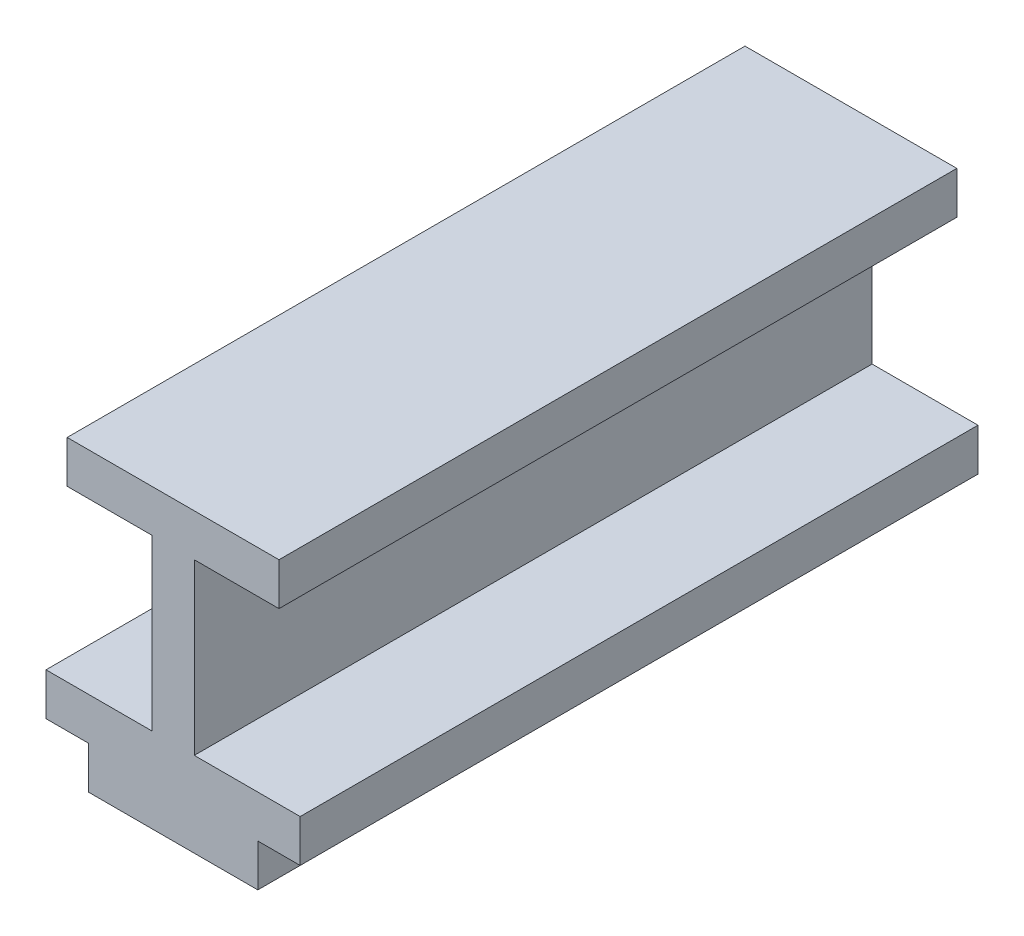
ISO-10303-21;
HEADER;
FILE_DESCRIPTION(('STEP AP214'),'2;1');
FILE_NAME('part.step','',(''),(''),'','','');
FILE_SCHEMA(('AUTOMOTIVE_DESIGN { 1 0 10303 214 1 1 1 1 }'));
ENDSEC;
DATA;
#1=APPLICATION_CONTEXT('core data for automotive mechanical design processes');
#2=APPLICATION_PROTOCOL_DEFINITION('international standard','automotive_design',2000,#1);
#3=PRODUCT_CONTEXT('',#1,'mechanical');
#4=PRODUCT('Part','Part','',(#3));
#5=PRODUCT_RELATED_PRODUCT_CATEGORY('part','',(#4));
#6=PRODUCT_DEFINITION_FORMATION('','',#4);
#7=PRODUCT_DEFINITION_CONTEXT('part definition',#1,'design');
#8=PRODUCT_DEFINITION('design','',#6,#7);
#9=PRODUCT_DEFINITION_SHAPE('','',#8);
#10=(LENGTH_UNIT() NAMED_UNIT(*) SI_UNIT(.MILLI.,.METRE.));
#11=(NAMED_UNIT(*) PLANE_ANGLE_UNIT() SI_UNIT($,.RADIAN.));
#12=(NAMED_UNIT(*) SI_UNIT($,.STERADIAN.) SOLID_ANGLE_UNIT());
#13=UNCERTAINTY_MEASURE_WITH_UNIT(LENGTH_MEASURE(1.E-05),#10,'distance_accuracy_value','');
#14=(GEOMETRIC_REPRESENTATION_CONTEXT(3) GLOBAL_UNCERTAINTY_ASSIGNED_CONTEXT((#13)) GLOBAL_UNIT_ASSIGNED_CONTEXT((#10,
#11,#12)) REPRESENTATION_CONTEXT('',''));
#15=CARTESIAN_POINT('',(0.,0.,0.));
#16=DIRECTION('',(0.,0.,1.));
#17=DIRECTION('',(1.,0.,0.));
#18=AXIS2_PLACEMENT_3D('',#15,#16,#17);
#19=CARTESIAN_POINT('',(0.,20.,160.));
#20=DIRECTION('',(0.,1.,0.));
#21=DIRECTION('',(0.,0.,1.));
#22=AXIS2_PLACEMENT_3D('',#19,#20,#21);
#23=PLANE('',#22);
#24=DIRECTION('',(1.,0.,0.));
#25=VECTOR('',#24,1.);
#26=CARTESIAN_POINT('',(0.,20.,0.));
#27=LINE('',#26,#25);
#28=CARTESIAN_POINT('',(-25.,20.,0.));
#29=VERTEX_POINT('',#28);
#30=CARTESIAN_POINT('',(-5.,20.,0.));
#31=VERTEX_POINT('',#30);
#32=EDGE_CURVE('E181',#29,#31,#27,.T.);
#33=ORIENTED_EDGE('',*,*,#32,.T.);
#34=DIRECTION('',(0.,0.,-1.));
#35=VECTOR('',#34,1.);
#36=CARTESIAN_POINT('',(-5.,20.,160.));
#37=LINE('',#36,#35);
#38=CARTESIAN_POINT('',(-5.,20.,160.));
#39=VERTEX_POINT('',#38);
#40=EDGE_CURVE('E11',#39,#31,#37,.T.);
#41=ORIENTED_EDGE('',*,*,#40,.F.);
#42=DIRECTION('',(1.,0.,0.));
#43=VECTOR('',#42,1.);
#44=CARTESIAN_POINT('',(0.,20.,160.));
#45=LINE('',#44,#43);
#46=CARTESIAN_POINT('',(-25.,20.,160.));
#47=VERTEX_POINT('',#46);
#48=EDGE_CURVE('E115',#47,#39,#45,.T.);
#49=ORIENTED_EDGE('',*,*,#48,.F.);
#50=DIRECTION('',(0.,0.,-1.));
#51=VECTOR('',#50,1.);
#52=CARTESIAN_POINT('',(-25.,20.,160.));
#53=LINE('',#52,#51);
#54=EDGE_CURVE('E54',#47,#29,#53,.T.);
#55=ORIENTED_EDGE('',*,*,#54,.T.);
#56=EDGE_LOOP('',(#33,#41,#49,#55));
#57=FACE_BOUND('',#56,.T.);
#58=ADVANCED_FACE('F37',(#57),#23,.F.);
#59=CARTESIAN_POINT('',(-5.,0.,160.));
#60=DIRECTION('',(-1.,0.,0.));
#61=DIRECTION('',(0.,0.,1.));
#62=AXIS2_PLACEMENT_3D('',#59,#60,#61);
#63=PLANE('',#62);
#64=DIRECTION('',(0.,1.,0.));
#65=VECTOR('',#64,1.);
#66=CARTESIAN_POINT('',(-5.,0.,0.));
#67=LINE('',#66,#65);
#68=CARTESIAN_POINT('',(-5.,-20.,0.));
#69=VERTEX_POINT('',#68);
#70=EDGE_CURVE('E183',#69,#31,#67,.T.);
#71=ORIENTED_EDGE('',*,*,#70,.F.);
#72=DIRECTION('',(0.,0.,-1.));
#73=VECTOR('',#72,1.);
#74=CARTESIAN_POINT('',(-5.,-20.,160.));
#75=LINE('',#74,#73);
#76=CARTESIAN_POINT('',(-5.,-20.,160.));
#77=VERTEX_POINT('',#76);
#78=EDGE_CURVE('E46',#77,#69,#75,.T.);
#79=ORIENTED_EDGE('',*,*,#78,.F.);
#80=DIRECTION('',(0.,1.,0.));
#81=VECTOR('',#80,1.);
#82=CARTESIAN_POINT('',(-5.,0.,160.));
#83=LINE('',#82,#81);
#84=EDGE_CURVE('E261',#77,#39,#83,.T.);
#85=ORIENTED_EDGE('',*,*,#84,.T.);
#86=ORIENTED_EDGE('',*,*,#40,.T.);
#87=EDGE_LOOP('',(#71,#79,#85,#86));
#88=FACE_BOUND('',#87,.T.);
#89=ADVANCED_FACE('F39',(#88),#63,.T.);
#90=CARTESIAN_POINT('',(0.,-20.,160.));
#91=DIRECTION('',(0.,1.,0.));
#92=DIRECTION('',(0.,0.,1.));
#93=AXIS2_PLACEMENT_3D('',#90,#91,#92);
#94=PLANE('',#93);
#95=DIRECTION('',(1.,0.,0.));
#96=VECTOR('',#95,1.);
#97=CARTESIAN_POINT('',(0.,-20.,0.));
#98=LINE('',#97,#96);
#99=CARTESIAN_POINT('',(-30.,-20.,0.));
#100=VERTEX_POINT('',#99);
#101=EDGE_CURVE('E187',#100,#69,#98,.T.);
#102=ORIENTED_EDGE('',*,*,#101,.F.);
#103=DIRECTION('',(0.,0.,-1.));
#104=VECTOR('',#103,1.);
#105=CARTESIAN_POINT('',(-30.,-20.,160.));
#106=LINE('',#105,#104);
#107=CARTESIAN_POINT('',(-30.,-20.,160.));
#108=VERTEX_POINT('',#107);
#109=EDGE_CURVE('E241',#108,#100,#106,.T.);
#110=ORIENTED_EDGE('',*,*,#109,.F.);
#111=DIRECTION('',(1.,0.,0.));
#112=VECTOR('',#111,1.);
#113=CARTESIAN_POINT('',(0.,-20.,160.));
#114=LINE('',#113,#112);
#115=EDGE_CURVE('E248',#108,#77,#114,.T.);
#116=ORIENTED_EDGE('',*,*,#115,.T.);
#117=ORIENTED_EDGE('',*,*,#78,.T.);
#118=EDGE_LOOP('',(#102,#110,#116,#117));
#119=FACE_BOUND('',#118,.T.);
#120=ADVANCED_FACE('F246',(#119),#94,.T.);
#121=CARTESIAN_POINT('',(-30.,0.,160.));
#122=DIRECTION('',(-1.,0.,0.));
#123=DIRECTION('',(0.,0.,1.));
#124=AXIS2_PLACEMENT_3D('',#121,#122,#123);
#125=PLANE('',#124);
#126=DIRECTION('',(0.,1.,0.));
#127=VECTOR('',#126,1.);
#128=CARTESIAN_POINT('',(-30.,0.,0.));
#129=LINE('',#128,#127);
#130=CARTESIAN_POINT('',(-30.,-30.,0.));
#131=VERTEX_POINT('',#130);
#132=EDGE_CURVE('E190',#131,#100,#129,.T.);
#133=ORIENTED_EDGE('',*,*,#132,.F.);
#134=DIRECTION('',(0.,0.,-1.));
#135=VECTOR('',#134,1.);
#136=CARTESIAN_POINT('',(-30.,-30.,160.));
#137=LINE('',#136,#135);
#138=CARTESIAN_POINT('',(-30.,-30.,160.));
#139=VERTEX_POINT('',#138);
#140=EDGE_CURVE('E239',#139,#131,#137,.T.);
#141=ORIENTED_EDGE('',*,*,#140,.F.);
#142=DIRECTION('',(0.,1.,0.));
#143=VECTOR('',#142,1.);
#144=CARTESIAN_POINT('',(-30.,0.,160.));
#145=LINE('',#144,#143);
#146=EDGE_CURVE('E260',#139,#108,#145,.T.);
#147=ORIENTED_EDGE('',*,*,#146,.T.);
#148=ORIENTED_EDGE('',*,*,#109,.T.);
#149=EDGE_LOOP('',(#133,#141,#147,#148));
#150=FACE_BOUND('',#149,.T.);
#151=ADVANCED_FACE('F256',(#150),#125,.T.);
#152=CARTESIAN_POINT('',(0.,-30.,160.));
#153=DIRECTION('',(0.,1.,0.));
#154=DIRECTION('',(0.,0.,1.));
#155=AXIS2_PLACEMENT_3D('',#152,#153,#154);
#156=PLANE('',#155);
#157=DIRECTION('',(1.,0.,0.));
#158=VECTOR('',#157,1.);
#159=CARTESIAN_POINT('',(0.,-30.,0.));
#160=LINE('',#159,#158);
#161=CARTESIAN_POINT('',(-20.,-30.,0.));
#162=VERTEX_POINT('',#161);
#163=EDGE_CURVE('E194',#131,#162,#160,.T.);
#164=ORIENTED_EDGE('',*,*,#163,.T.);
#165=DIRECTION('',(0.,0.,-1.));
#166=VECTOR('',#165,1.);
#167=CARTESIAN_POINT('',(-20.,-30.,160.));
#168=LINE('',#167,#166);
#169=CARTESIAN_POINT('',(-20.,-30.,160.));
#170=VERTEX_POINT('',#169);
#171=EDGE_CURVE('E237',#170,#162,#168,.T.);
#172=ORIENTED_EDGE('',*,*,#171,.F.);
#173=DIRECTION('',(1.,0.,0.));
#174=VECTOR('',#173,1.);
#175=CARTESIAN_POINT('',(0.,-30.,160.));
#176=LINE('',#175,#174);
#177=EDGE_CURVE('E264',#139,#170,#176,.T.);
#178=ORIENTED_EDGE('',*,*,#177,.F.);
#179=ORIENTED_EDGE('',*,*,#140,.T.);
#180=EDGE_LOOP('',(#164,#172,#178,#179));
#181=FACE_BOUND('',#180,.T.);
#182=ADVANCED_FACE('F287',(#181),#156,.F.);
#183=CARTESIAN_POINT('',(-20.,0.,160.));
#184=DIRECTION('',(-1.,0.,0.));
#185=DIRECTION('',(0.,0.,1.));
#186=AXIS2_PLACEMENT_3D('',#183,#184,#185);
#187=PLANE('',#186);
#188=DIRECTION('',(0.,1.,0.));
#189=VECTOR('',#188,1.);
#190=CARTESIAN_POINT('',(-20.,0.,0.));
#191=LINE('',#190,#189);
#192=CARTESIAN_POINT('',(-20.,-40.,0.));
#193=VERTEX_POINT('',#192);
#194=EDGE_CURVE('E197',#193,#162,#191,.T.);
#195=ORIENTED_EDGE('',*,*,#194,.F.);
#196=DIRECTION('',(0.,0.,-1.));
#197=VECTOR('',#196,1.);
#198=CARTESIAN_POINT('',(-20.,-40.,160.));
#199=LINE('',#198,#197);
#200=CARTESIAN_POINT('',(-20.,-40.,160.));
#201=VERTEX_POINT('',#200);
#202=EDGE_CURVE('E235',#201,#193,#199,.T.);
#203=ORIENTED_EDGE('',*,*,#202,.F.);
#204=DIRECTION('',(0.,1.,0.));
#205=VECTOR('',#204,1.);
#206=CARTESIAN_POINT('',(-20.,0.,160.));
#207=LINE('',#206,#205);
#208=EDGE_CURVE('E282',#201,#170,#207,.T.);
#209=ORIENTED_EDGE('',*,*,#208,.T.);
#210=ORIENTED_EDGE('',*,*,#171,.T.);
#211=EDGE_LOOP('',(#195,#203,#209,#210));
#212=FACE_BOUND('',#211,.T.);
#213=ADVANCED_FACE('F290',(#212),#187,.T.);
#214=CARTESIAN_POINT('',(0.,-40.,160.));
#215=DIRECTION('',(0.,1.,0.));
#216=DIRECTION('',(0.,0.,1.));
#217=AXIS2_PLACEMENT_3D('',#214,#215,#216);
#218=PLANE('',#217);
#219=DIRECTION('',(1.,0.,0.));
#220=VECTOR('',#219,1.);
#221=CARTESIAN_POINT('',(0.,-40.,0.));
#222=LINE('',#221,#220);
#223=CARTESIAN_POINT('',(20.,-40.,0.));
#224=VERTEX_POINT('',#223);
#225=EDGE_CURVE('E201',#193,#224,#222,.T.);
#226=ORIENTED_EDGE('',*,*,#225,.T.);
#227=DIRECTION('',(0.,0.,-1.));
#228=VECTOR('',#227,1.);
#229=CARTESIAN_POINT('',(20.,-40.,160.));
#230=LINE('',#229,#228);
#231=CARTESIAN_POINT('',(20.,-40.,160.));
#232=VERTEX_POINT('',#231);
#233=EDGE_CURVE('E232',#232,#224,#230,.T.);
#234=ORIENTED_EDGE('',*,*,#233,.F.);
#235=DIRECTION('',(1.,0.,0.));
#236=VECTOR('',#235,1.);
#237=CARTESIAN_POINT('',(0.,-40.,160.));
#238=LINE('',#237,#236);
#239=EDGE_CURVE('E280',#201,#232,#238,.T.);
#240=ORIENTED_EDGE('',*,*,#239,.F.);
#241=ORIENTED_EDGE('',*,*,#202,.T.);
#242=EDGE_LOOP('',(#226,#234,#240,#241));
#243=FACE_BOUND('',#242,.T.);
#244=ADVANCED_FACE('F295',(#243),#218,.F.);
#245=CARTESIAN_POINT('',(20.,0.,160.));
#246=DIRECTION('',(-1.,0.,0.));
#247=DIRECTION('',(0.,0.,1.));
#248=AXIS2_PLACEMENT_3D('',#245,#246,#247);
#249=PLANE('',#248);
#250=DIRECTION('',(0.,1.,0.));
#251=VECTOR('',#250,1.);
#252=CARTESIAN_POINT('',(20.,0.,0.));
#253=LINE('',#252,#251);
#254=CARTESIAN_POINT('',(20.,-30.,0.));
#255=VERTEX_POINT('',#254);
#256=EDGE_CURVE('E203',#224,#255,#253,.T.);
#257=ORIENTED_EDGE('',*,*,#256,.T.);
#258=DIRECTION('',(0.,0.,-1.));
#259=VECTOR('',#258,1.);
#260=CARTESIAN_POINT('',(20.,-30.,160.));
#261=LINE('',#260,#259);
#262=CARTESIAN_POINT('',(20.,-30.,160.));
#263=VERTEX_POINT('',#262);
#264=EDGE_CURVE('E229',#263,#255,#261,.T.);
#265=ORIENTED_EDGE('',*,*,#264,.F.);
#266=DIRECTION('',(0.,1.,0.));
#267=VECTOR('',#266,1.);
#268=CARTESIAN_POINT('',(20.,0.,160.));
#269=LINE('',#268,#267);
#270=EDGE_CURVE('E276',#232,#263,#269,.T.);
#271=ORIENTED_EDGE('',*,*,#270,.F.);
#272=ORIENTED_EDGE('',*,*,#233,.T.);
#273=EDGE_LOOP('',(#257,#265,#271,#272));
#274=FACE_BOUND('',#273,.T.);
#275=ADVANCED_FACE('F301',(#274),#249,.F.);
#276=CARTESIAN_POINT('',(30.,-30.,0.));
#277=VERTEX_POINT('',#276);
#278=EDGE_CURVE('E198',#255,#277,#160,.T.);
#279=ORIENTED_EDGE('',*,*,#278,.T.);
#280=DIRECTION('',(0.,0.,-1.));
#281=VECTOR('',#280,1.);
#282=CARTESIAN_POINT('',(30.,-30.,160.));
#283=LINE('',#282,#281);
#284=CARTESIAN_POINT('',(30.,-30.,160.));
#285=VERTEX_POINT('',#284);
#286=EDGE_CURVE('E226',#285,#277,#283,.T.);
#287=ORIENTED_EDGE('',*,*,#286,.F.);
#288=EDGE_CURVE('E272',#263,#285,#176,.T.);
#289=ORIENTED_EDGE('',*,*,#288,.F.);
#290=ORIENTED_EDGE('',*,*,#264,.T.);
#291=EDGE_LOOP('',(#279,#287,#289,#290));
#292=FACE_BOUND('',#291,.T.);
#293=ADVANCED_FACE('F305',(#292),#156,.F.);
#294=CARTESIAN_POINT('',(30.,0.,160.));
#295=DIRECTION('',(-1.,0.,0.));
#296=DIRECTION('',(0.,0.,1.));
#297=AXIS2_PLACEMENT_3D('',#294,#295,#296);
#298=PLANE('',#297);
#299=DIRECTION('',(0.,1.,0.));
#300=VECTOR('',#299,1.);
#301=CARTESIAN_POINT('',(30.,0.,0.));
#302=LINE('',#301,#300);
#303=CARTESIAN_POINT('',(30.,-20.,0.));
#304=VERTEX_POINT('',#303);
#305=EDGE_CURVE('E205',#277,#304,#302,.T.);
#306=ORIENTED_EDGE('',*,*,#305,.T.);
#307=DIRECTION('',(0.,0.,-1.));
#308=VECTOR('',#307,1.);
#309=CARTESIAN_POINT('',(30.,-20.,160.));
#310=LINE('',#309,#308);
#311=CARTESIAN_POINT('',(30.,-20.,160.));
#312=VERTEX_POINT('',#311);
#313=EDGE_CURVE('E224',#312,#304,#310,.T.);
#314=ORIENTED_EDGE('',*,*,#313,.F.);
#315=DIRECTION('',(0.,1.,0.));
#316=VECTOR('',#315,1.);
#317=CARTESIAN_POINT('',(30.,0.,160.));
#318=LINE('',#317,#316);
#319=EDGE_CURVE('E269',#285,#312,#318,.T.);
#320=ORIENTED_EDGE('',*,*,#319,.F.);
#321=ORIENTED_EDGE('',*,*,#286,.T.);
#322=EDGE_LOOP('',(#306,#314,#320,#321));
#323=FACE_BOUND('',#322,.T.);
#324=ADVANCED_FACE('F308',(#323),#298,.F.);
#325=CARTESIAN_POINT('',(5.,-20.,0.));
#326=VERTEX_POINT('',#325);
#327=EDGE_CURVE('E191',#326,#304,#98,.T.);
#328=ORIENTED_EDGE('',*,*,#327,.F.);
#329=DIRECTION('',(0.,0.,-1.));
#330=VECTOR('',#329,1.);
#331=CARTESIAN_POINT('',(5.,-20.,160.));
#332=LINE('',#331,#330);
#333=CARTESIAN_POINT('',(5.,-20.,160.));
#334=VERTEX_POINT('',#333);
#335=EDGE_CURVE('E222',#334,#326,#332,.T.);
#336=ORIENTED_EDGE('',*,*,#335,.F.);
#337=EDGE_CURVE('E263',#334,#312,#114,.T.);
#338=ORIENTED_EDGE('',*,*,#337,.T.);
#339=ORIENTED_EDGE('',*,*,#313,.T.);
#340=EDGE_LOOP('',(#328,#336,#338,#339));
#341=FACE_BOUND('',#340,.T.);
#342=ADVANCED_FACE('F311',(#341),#94,.T.);
#343=CARTESIAN_POINT('',(5.,0.,160.));
#344=DIRECTION('',(-1.,0.,0.));
#345=DIRECTION('',(0.,0.,1.));
#346=AXIS2_PLACEMENT_3D('',#343,#344,#345);
#347=PLANE('',#346);
#348=DIRECTION('',(0.,1.,0.));
#349=VECTOR('',#348,1.);
#350=CARTESIAN_POINT('',(5.,0.,0.));
#351=LINE('',#350,#349);
#352=CARTESIAN_POINT('',(5.,20.,0.));
#353=VERTEX_POINT('',#352);
#354=EDGE_CURVE('E208',#326,#353,#351,.T.);
#355=ORIENTED_EDGE('',*,*,#354,.T.);
#356=DIRECTION('',(0.,0.,-1.));
#357=VECTOR('',#356,1.);
#358=CARTESIAN_POINT('',(5.,20.,160.));
#359=LINE('',#358,#357);
#360=CARTESIAN_POINT('',(5.,20.,160.));
#361=VERTEX_POINT('',#360);
#362=EDGE_CURVE('E219',#361,#353,#359,.T.);
#363=ORIENTED_EDGE('',*,*,#362,.F.);
#364=DIRECTION('',(0.,1.,0.));
#365=VECTOR('',#364,1.);
#366=CARTESIAN_POINT('',(5.,0.,160.));
#367=LINE('',#366,#365);
#368=EDGE_CURVE('E268',#334,#361,#367,.T.);
#369=ORIENTED_EDGE('',*,*,#368,.F.);
#370=ORIENTED_EDGE('',*,*,#335,.T.);
#371=EDGE_LOOP('',(#355,#363,#369,#370));
#372=FACE_BOUND('',#371,.T.);
#373=ADVANCED_FACE('F317',(#372),#347,.F.);
#374=CARTESIAN_POINT('',(25.,20.,0.));
#375=VERTEX_POINT('',#374);
#376=EDGE_CURVE('E184',#353,#375,#27,.T.);
#377=ORIENTED_EDGE('',*,*,#376,.T.);
#378=DIRECTION('',(0.,0.,-1.));
#379=VECTOR('',#378,1.);
#380=CARTESIAN_POINT('',(25.,20.,160.));
#381=LINE('',#380,#379);
#382=CARTESIAN_POINT('',(25.,20.,160.));
#383=VERTEX_POINT('',#382);
#384=EDGE_CURVE('E173',#383,#375,#381,.T.);
#385=ORIENTED_EDGE('',*,*,#384,.F.);
#386=EDGE_CURVE('E161',#361,#383,#45,.T.);
#387=ORIENTED_EDGE('',*,*,#386,.F.);
#388=ORIENTED_EDGE('',*,*,#362,.T.);
#389=EDGE_LOOP('',(#377,#385,#387,#388));
#390=FACE_BOUND('',#389,.T.);
#391=ADVANCED_FACE('F319',(#390),#23,.F.);
#392=CARTESIAN_POINT('',(25.,0.,160.));
#393=DIRECTION('',(-1.,0.,0.));
#394=DIRECTION('',(0.,0.,1.));
#395=AXIS2_PLACEMENT_3D('',#392,#393,#394);
#396=PLANE('',#395);
#397=DIRECTION('',(0.,1.,0.));
#398=VECTOR('',#397,1.);
#399=CARTESIAN_POINT('',(25.,0.,0.));
#400=LINE('',#399,#398);
#401=CARTESIAN_POINT('',(25.,30.,0.));
#402=VERTEX_POINT('',#401);
#403=EDGE_CURVE('E170',#375,#402,#400,.T.);
#404=ORIENTED_EDGE('',*,*,#403,.T.);
#405=DIRECTION('',(0.,0.,-1.));
#406=VECTOR('',#405,1.);
#407=CARTESIAN_POINT('',(25.,30.,160.));
#408=LINE('',#407,#406);
#409=CARTESIAN_POINT('',(25.,30.,160.));
#410=VERTEX_POINT('',#409);
#411=EDGE_CURVE('E167',#410,#402,#408,.T.);
#412=ORIENTED_EDGE('',*,*,#411,.F.);
#413=DIRECTION('',(0.,1.,0.));
#414=VECTOR('',#413,1.);
#415=CARTESIAN_POINT('',(25.,0.,160.));
#416=LINE('',#415,#414);
#417=EDGE_CURVE('E155',#383,#410,#416,.T.);
#418=ORIENTED_EDGE('',*,*,#417,.F.);
#419=ORIENTED_EDGE('',*,*,#384,.T.);
#420=EDGE_LOOP('',(#404,#412,#418,#419));
#421=FACE_BOUND('',#420,.T.);
#422=ADVANCED_FACE('F168',(#421),#396,.F.);
#423=CARTESIAN_POINT('',(0.,30.,160.));
#424=DIRECTION('',(0.,1.,0.));
#425=DIRECTION('',(0.,0.,1.));
#426=AXIS2_PLACEMENT_3D('',#423,#424,#425);
#427=PLANE('',#426);
#428=DIRECTION('',(1.,0.,0.));
#429=VECTOR('',#428,1.);
#430=CARTESIAN_POINT('',(0.,30.,0.));
#431=LINE('',#430,#429);
#432=CARTESIAN_POINT('',(-25.,30.,0.));
#433=VERTEX_POINT('',#432);
#434=EDGE_CURVE('E211',#433,#402,#431,.T.);
#435=ORIENTED_EDGE('',*,*,#434,.F.);
#436=DIRECTION('',(0.,0.,-1.));
#437=VECTOR('',#436,1.);
#438=CARTESIAN_POINT('',(-25.,30.,160.));
#439=LINE('',#438,#437);
#440=CARTESIAN_POINT('',(-25.,30.,160.));
#441=VERTEX_POINT('',#440);
#442=EDGE_CURVE('E103',#441,#433,#439,.T.);
#443=ORIENTED_EDGE('',*,*,#442,.F.);
#444=DIRECTION('',(1.,0.,0.));
#445=VECTOR('',#444,1.);
#446=CARTESIAN_POINT('',(0.,30.,160.));
#447=LINE('',#446,#445);
#448=EDGE_CURVE('E159',#441,#410,#447,.T.);
#449=ORIENTED_EDGE('',*,*,#448,.T.);
#450=ORIENTED_EDGE('',*,*,#411,.T.);
#451=EDGE_LOOP('',(#435,#443,#449,#450));
#452=FACE_BOUND('',#451,.T.);
#453=ADVANCED_FACE('F175',(#452),#427,.T.);
#454=CARTESIAN_POINT('',(-25.,0.,160.));
#455=DIRECTION('',(-1.,0.,0.));
#456=DIRECTION('',(0.,0.,1.));
#457=AXIS2_PLACEMENT_3D('',#454,#455,#456);
#458=PLANE('',#457);
#459=DIRECTION('',(0.,1.,0.));
#460=VECTOR('',#459,1.);
#461=CARTESIAN_POINT('',(-25.,0.,0.));
#462=LINE('',#461,#460);
#463=EDGE_CURVE('E213',#29,#433,#462,.T.);
#464=ORIENTED_EDGE('',*,*,#463,.F.);
#465=ORIENTED_EDGE('',*,*,#54,.F.);
#466=DIRECTION('',(0.,1.,0.));
#467=VECTOR('',#466,1.);
#468=CARTESIAN_POINT('',(-25.,0.,160.));
#469=LINE('',#468,#467);
#470=EDGE_CURVE('E176',#47,#441,#469,.T.);
#471=ORIENTED_EDGE('',*,*,#470,.T.);
#472=ORIENTED_EDGE('',*,*,#442,.T.);
#473=EDGE_LOOP('',(#464,#465,#471,#472));
#474=FACE_BOUND('',#473,.T.);
#475=ADVANCED_FACE('F321',(#474),#458,.T.);
#476=CARTESIAN_POINT('',(0.,0.,160.));
#477=DIRECTION('',(0.,0.,1.));
#478=DIRECTION('',(1.,0.,0.));
#479=AXIS2_PLACEMENT_3D('',#476,#477,#478);
#480=PLANE('',#479);
#481=ORIENTED_EDGE('',*,*,#48,.T.);
#482=ORIENTED_EDGE('',*,*,#84,.F.);
#483=ORIENTED_EDGE('',*,*,#115,.F.);
#484=ORIENTED_EDGE('',*,*,#146,.F.);
#485=ORIENTED_EDGE('',*,*,#177,.T.);
#486=ORIENTED_EDGE('',*,*,#208,.F.);
#487=ORIENTED_EDGE('',*,*,#239,.T.);
#488=ORIENTED_EDGE('',*,*,#270,.T.);
#489=ORIENTED_EDGE('',*,*,#288,.T.);
#490=ORIENTED_EDGE('',*,*,#319,.T.);
#491=ORIENTED_EDGE('',*,*,#337,.F.);
#492=ORIENTED_EDGE('',*,*,#368,.T.);
#493=ORIENTED_EDGE('',*,*,#386,.T.);
#494=ORIENTED_EDGE('',*,*,#417,.T.);
#495=ORIENTED_EDGE('',*,*,#448,.F.);
#496=ORIENTED_EDGE('',*,*,#470,.F.);
#497=EDGE_LOOP('',(#481,#482,#483,#484,#485,#486,#487,#488,#489,#490,#491,#492,#493,#494,#495,#496));
#498=FACE_BOUND('',#497,.T.);
#499=ADVANCED_FACE('F157',(#498),#480,.T.);
#500=CARTESIAN_POINT('',(0.,0.,0.));
#501=DIRECTION('',(0.,0.,1.));
#502=DIRECTION('',(1.,0.,0.));
#503=AXIS2_PLACEMENT_3D('',#500,#501,#502);
#504=PLANE('',#503);
#505=ORIENTED_EDGE('',*,*,#32,.F.);
#506=ORIENTED_EDGE('',*,*,#463,.T.);
#507=ORIENTED_EDGE('',*,*,#434,.T.);
#508=ORIENTED_EDGE('',*,*,#403,.F.);
#509=ORIENTED_EDGE('',*,*,#376,.F.);
#510=ORIENTED_EDGE('',*,*,#354,.F.);
#511=ORIENTED_EDGE('',*,*,#327,.T.);
#512=ORIENTED_EDGE('',*,*,#305,.F.);
#513=ORIENTED_EDGE('',*,*,#278,.F.);
#514=ORIENTED_EDGE('',*,*,#256,.F.);
#515=ORIENTED_EDGE('',*,*,#225,.F.);
#516=ORIENTED_EDGE('',*,*,#194,.T.);
#517=ORIENTED_EDGE('',*,*,#163,.F.);
#518=ORIENTED_EDGE('',*,*,#132,.T.);
#519=ORIENTED_EDGE('',*,*,#101,.T.);
#520=ORIENTED_EDGE('',*,*,#70,.T.);
#521=EDGE_LOOP('',(#505,#506,#507,#508,#509,#510,#511,#512,#513,#514,#515,#516,#517,#518,#519,#520));
#522=FACE_BOUND('',#521,.T.);
#523=ADVANCED_FACE('F252',(#522),#504,.F.);
#524=CLOSED_SHELL('',(#58,#89,#120,#151,#182,#213,#244,#275,#293,#324,#342,#373,#391,#422,#453,
#475,#499,#523));
#525=MANIFOLD_SOLID_BREP('B2',#524);
#526=ADVANCED_BREP_SHAPE_REPRESENTATION('',(#18,#525),#14);
#527=SHAPE_DEFINITION_REPRESENTATION(#9,#526);
ENDSEC;
END-ISO-10303-21;
